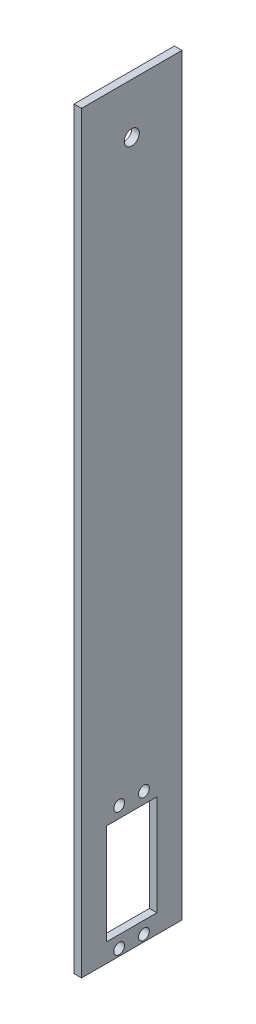
ISO-10303-21;
HEADER;
FILE_DESCRIPTION(('STEP AP214'),'2;1');
FILE_NAME('part.step','',(''),(''),'','','');
FILE_SCHEMA(('AUTOMOTIVE_DESIGN { 1 0 10303 214 1 1 1 1 }'));
ENDSEC;
DATA;
#1=APPLICATION_CONTEXT('core data for automotive mechanical design processes');
#2=APPLICATION_PROTOCOL_DEFINITION('international standard','automotive_design',2000,#1);
#3=PRODUCT_CONTEXT('',#1,'mechanical');
#4=PRODUCT('Part','Part','',(#3));
#5=PRODUCT_RELATED_PRODUCT_CATEGORY('part','',(#4));
#6=PRODUCT_DEFINITION_FORMATION('','',#4);
#7=PRODUCT_DEFINITION_CONTEXT('part definition',#1,'design');
#8=PRODUCT_DEFINITION('design','',#6,#7);
#9=PRODUCT_DEFINITION_SHAPE('','',#8);
#10=(LENGTH_UNIT() NAMED_UNIT(*) SI_UNIT(.MILLI.,.METRE.));
#11=(NAMED_UNIT(*) PLANE_ANGLE_UNIT() SI_UNIT($,.RADIAN.));
#12=(NAMED_UNIT(*) SI_UNIT($,.STERADIAN.) SOLID_ANGLE_UNIT());
#13=UNCERTAINTY_MEASURE_WITH_UNIT(LENGTH_MEASURE(1.E-05),#10,'distance_accuracy_value','');
#14=(GEOMETRIC_REPRESENTATION_CONTEXT(3) GLOBAL_UNCERTAINTY_ASSIGNED_CONTEXT((#13)) GLOBAL_UNIT_ASSIGNED_CONTEXT((#10,
#11,#12)) REPRESENTATION_CONTEXT('',''));
#15=CARTESIAN_POINT('',(0.,0.,0.));
#16=DIRECTION('',(0.,0.,1.));
#17=DIRECTION('',(1.,0.,0.));
#18=AXIS2_PLACEMENT_3D('',#15,#16,#17);
#19=CARTESIAN_POINT('',(3.,-150.,-20.));
#20=DIRECTION('',(0.,0.,1.));
#21=DIRECTION('',(1.,0.,0.));
#22=AXIS2_PLACEMENT_3D('',#19,#20,#21);
#23=PLANE('',#22);
#24=DIRECTION('',(0.,1.,0.));
#25=VECTOR('',#24,1.);
#26=CARTESIAN_POINT('',(0.,-150.,-20.));
#27=LINE('',#26,#25);
#28=CARTESIAN_POINT('',(0.,-150.,-20.));
#29=VERTEX_POINT('',#28);
#30=CARTESIAN_POINT('',(0.,150.,-20.));
#31=VERTEX_POINT('',#30);
#32=EDGE_CURVE('E141',#29,#31,#27,.T.);
#33=ORIENTED_EDGE('',*,*,#32,.T.);
#34=DIRECTION('',(-1.,0.,0.));
#35=VECTOR('',#34,1.);
#36=CARTESIAN_POINT('',(3.,150.,-20.));
#37=LINE('',#36,#35);
#38=CARTESIAN_POINT('',(3.,150.,-20.));
#39=VERTEX_POINT('',#38);
#40=EDGE_CURVE('E11',#39,#31,#37,.T.);
#41=ORIENTED_EDGE('',*,*,#40,.F.);
#42=DIRECTION('',(0.,1.,0.));
#43=VECTOR('',#42,1.);
#44=CARTESIAN_POINT('',(3.,-150.,-20.));
#45=LINE('',#44,#43);
#46=CARTESIAN_POINT('',(3.,-150.,-20.));
#47=VERTEX_POINT('',#46);
#48=EDGE_CURVE('E144',#47,#39,#45,.T.);
#49=ORIENTED_EDGE('',*,*,#48,.F.);
#50=DIRECTION('',(-1.,0.,0.));
#51=VECTOR('',#50,1.);
#52=CARTESIAN_POINT('',(3.,-150.,-20.));
#53=LINE('',#52,#51);
#54=EDGE_CURVE('E154',#47,#29,#53,.T.);
#55=ORIENTED_EDGE('',*,*,#54,.T.);
#56=EDGE_LOOP('',(#33,#41,#49,#55));
#57=FACE_BOUND('',#56,.T.);
#58=ADVANCED_FACE('F33',(#57),#23,.F.);
#59=CARTESIAN_POINT('',(3.,150.,20.));
#60=DIRECTION('',(0.,-1.,0.));
#61=DIRECTION('',(0.,0.,-1.));
#62=AXIS2_PLACEMENT_3D('',#59,#60,#61);
#63=PLANE('',#62);
#64=DIRECTION('',(0.,0.,1.));
#65=VECTOR('',#64,1.);
#66=CARTESIAN_POINT('',(0.,150.,20.));
#67=LINE('',#66,#65);
#68=CARTESIAN_POINT('',(0.,150.,20.));
#69=VERTEX_POINT('',#68);
#70=EDGE_CURVE('E157',#31,#69,#67,.T.);
#71=ORIENTED_EDGE('',*,*,#70,.T.);
#72=DIRECTION('',(-1.,0.,0.));
#73=VECTOR('',#72,1.);
#74=CARTESIAN_POINT('',(3.,150.,20.));
#75=LINE('',#74,#73);
#76=CARTESIAN_POINT('',(3.,150.,20.));
#77=VERTEX_POINT('',#76);
#78=EDGE_CURVE('E40',#77,#69,#75,.T.);
#79=ORIENTED_EDGE('',*,*,#78,.F.);
#80=DIRECTION('',(0.,0.,1.));
#81=VECTOR('',#80,1.);
#82=CARTESIAN_POINT('',(3.,150.,20.));
#83=LINE('',#82,#81);
#84=EDGE_CURVE('E147',#39,#77,#83,.T.);
#85=ORIENTED_EDGE('',*,*,#84,.F.);
#86=ORIENTED_EDGE('',*,*,#40,.T.);
#87=EDGE_LOOP('',(#71,#79,#85,#86));
#88=FACE_BOUND('',#87,.T.);
#89=ADVANCED_FACE('F186',(#88),#63,.F.);
#90=CARTESIAN_POINT('',(3.,-150.,20.));
#91=DIRECTION('',(0.,0.,-1.));
#92=DIRECTION('',(-1.,0.,0.));
#93=AXIS2_PLACEMENT_3D('',#90,#91,#92);
#94=PLANE('',#93);
#95=DIRECTION('',(0.,-1.,0.));
#96=VECTOR('',#95,1.);
#97=CARTESIAN_POINT('',(0.,-150.,20.));
#98=LINE('',#97,#96);
#99=CARTESIAN_POINT('',(0.,-150.,20.));
#100=VERTEX_POINT('',#99);
#101=EDGE_CURVE('E159',#69,#100,#98,.T.);
#102=ORIENTED_EDGE('',*,*,#101,.T.);
#103=DIRECTION('',(-1.,0.,0.));
#104=VECTOR('',#103,1.);
#105=CARTESIAN_POINT('',(3.,-150.,20.));
#106=LINE('',#105,#104);
#107=CARTESIAN_POINT('',(3.,-150.,20.));
#108=VERTEX_POINT('',#107);
#109=EDGE_CURVE('E164',#108,#100,#106,.T.);
#110=ORIENTED_EDGE('',*,*,#109,.F.);
#111=DIRECTION('',(0.,-1.,0.));
#112=VECTOR('',#111,1.);
#113=CARTESIAN_POINT('',(3.,-150.,20.));
#114=LINE('',#113,#112);
#115=EDGE_CURVE('E150',#77,#108,#114,.T.);
#116=ORIENTED_EDGE('',*,*,#115,.F.);
#117=ORIENTED_EDGE('',*,*,#78,.T.);
#118=EDGE_LOOP('',(#102,#110,#116,#117));
#119=FACE_BOUND('',#118,.T.);
#120=ADVANCED_FACE('F171',(#119),#94,.F.);
#121=CARTESIAN_POINT('',(3.,-150.,20.));
#122=DIRECTION('',(0.,1.,0.));
#123=DIRECTION('',(0.,0.,1.));
#124=AXIS2_PLACEMENT_3D('',#121,#122,#123);
#125=PLANE('',#124);
#126=DIRECTION('',(0.,0.,-1.));
#127=VECTOR('',#126,1.);
#128=CARTESIAN_POINT('',(0.,-150.,20.));
#129=LINE('',#128,#127);
#130=EDGE_CURVE('E148',#100,#29,#129,.T.);
#131=ORIENTED_EDGE('',*,*,#130,.T.);
#132=ORIENTED_EDGE('',*,*,#54,.F.);
#133=DIRECTION('',(0.,0.,-1.));
#134=VECTOR('',#133,1.);
#135=CARTESIAN_POINT('',(3.,-150.,20.));
#136=LINE('',#135,#134);
#137=EDGE_CURVE('E152',#108,#47,#136,.T.);
#138=ORIENTED_EDGE('',*,*,#137,.F.);
#139=ORIENTED_EDGE('',*,*,#109,.T.);
#140=EDGE_LOOP('',(#131,#132,#138,#139));
#141=FACE_BOUND('',#140,.T.);
#142=ADVANCED_FACE('F179',(#141),#125,.F.);
#143=CARTESIAN_POINT('',(3.,0.,0.));
#144=DIRECTION('',(-1.,0.,0.));
#145=DIRECTION('',(0.,0.,1.));
#146=AXIS2_PLACEMENT_3D('',#143,#144,#145);
#147=PLANE('',#146);
#148=CARTESIAN_POINT('',(3.,-98.01,-4.84499999999997));
#149=DIRECTION('',(1.,0.,0.));
#150=DIRECTION('',(0.,0.,-1.));
#151=AXIS2_PLACEMENT_3D('',#148,#149,#150);
#152=CIRCLE('',#151,2.15);
#153=CARTESIAN_POINT('',(3.,-98.01,-6.99499999999997));
#154=VERTEX_POINT('',#153);
#155=EDGE_CURVE('E121',#154,#154,#152,.T.);
#156=ORIENTED_EDGE('',*,*,#155,.F.);
#157=EDGE_LOOP('',(#156));
#158=FACE_BOUND('',#157,.T.);
#159=CARTESIAN_POINT('',(3.,-98.01,5.02499999999999));
#160=DIRECTION('',(1.,0.,0.));
#161=DIRECTION('',(0.,0.,-1.));
#162=AXIS2_PLACEMENT_3D('',#159,#160,#161);
#163=CIRCLE('',#162,2.14999999999999);
#164=CARTESIAN_POINT('',(3.,-98.01,2.875));
#165=VERTEX_POINT('',#164);
#166=EDGE_CURVE('E253',#165,#165,#163,.T.);
#167=ORIENTED_EDGE('',*,*,#166,.F.);
#168=EDGE_LOOP('',(#167));
#169=FACE_BOUND('',#168,.T.);
#170=CARTESIAN_POINT('',(3.,-147.31,-4.84499999999999));
#171=DIRECTION('',(1.,0.,0.));
#172=DIRECTION('',(0.,0.,-1.));
#173=AXIS2_PLACEMENT_3D('',#170,#171,#172);
#174=CIRCLE('',#173,2.15000000000001);
#175=CARTESIAN_POINT('',(3.,-147.31,-6.995));
#176=VERTEX_POINT('',#175);
#177=EDGE_CURVE('E245',#176,#176,#174,.T.);
#178=ORIENTED_EDGE('',*,*,#177,.F.);
#179=EDGE_LOOP('',(#178));
#180=FACE_BOUND('',#179,.T.);
#181=CARTESIAN_POINT('',(3.,-147.31,5.02500000000001));
#182=DIRECTION('',(1.,0.,0.));
#183=DIRECTION('',(0.,0.,-1.));
#184=AXIS2_PLACEMENT_3D('',#181,#182,#183);
#185=CIRCLE('',#184,2.15000000000001);
#186=CARTESIAN_POINT('',(3.,-147.31,2.875));
#187=VERTEX_POINT('',#186);
#188=EDGE_CURVE('E239',#187,#187,#185,.T.);
#189=ORIENTED_EDGE('',*,*,#188,.F.);
#190=EDGE_LOOP('',(#189));
#191=FACE_BOUND('',#190,.T.);
#192=DIRECTION('',(0.,0.,1.));
#193=VECTOR('',#192,1.);
#194=CARTESIAN_POINT('',(3.,-102.5,10.));
#195=LINE('',#194,#193);
#196=CARTESIAN_POINT('',(3.,-102.5,-10.));
#197=VERTEX_POINT('',#196);
#198=CARTESIAN_POINT('',(3.,-102.5,10.));
#199=VERTEX_POINT('',#198);
#200=EDGE_CURVE('E127',#197,#199,#195,.T.);
#201=ORIENTED_EDGE('',*,*,#200,.F.);
#202=DIRECTION('',(0.,1.,0.));
#203=VECTOR('',#202,1.);
#204=CARTESIAN_POINT('',(3.,-142.5,-10.));
#205=LINE('',#204,#203);
#206=CARTESIAN_POINT('',(3.,-142.5,-10.));
#207=VERTEX_POINT('',#206);
#208=EDGE_CURVE('E47',#207,#197,#205,.T.);
#209=ORIENTED_EDGE('',*,*,#208,.F.);
#210=DIRECTION('',(0.,0.,-1.));
#211=VECTOR('',#210,1.);
#212=CARTESIAN_POINT('',(3.,-142.5,10.));
#213=LINE('',#212,#211);
#214=CARTESIAN_POINT('',(3.,-142.5,10.));
#215=VERTEX_POINT('',#214);
#216=EDGE_CURVE('E115',#215,#207,#213,.T.);
#217=ORIENTED_EDGE('',*,*,#216,.F.);
#218=DIRECTION('',(0.,-1.,0.));
#219=VECTOR('',#218,1.);
#220=CARTESIAN_POINT('',(3.,-142.5,10.));
#221=LINE('',#220,#219);
#222=EDGE_CURVE('E118',#199,#215,#221,.T.);
#223=ORIENTED_EDGE('',*,*,#222,.F.);
#224=EDGE_LOOP('',(#201,#209,#217,#223));
#225=FACE_BOUND('',#224,.T.);
#226=CARTESIAN_POINT('',(3.,130.,0.));
#227=DIRECTION('',(1.,0.,0.));
#228=DIRECTION('',(0.,0.,-1.));
#229=AXIS2_PLACEMENT_3D('',#226,#227,#228);
#230=CIRCLE('',#229,3.);
#231=CARTESIAN_POINT('',(3.,130.,-3.));
#232=VERTEX_POINT('',#231);
#233=EDGE_CURVE('E134',#232,#232,#230,.T.);
#234=ORIENTED_EDGE('',*,*,#233,.F.);
#235=EDGE_LOOP('',(#234));
#236=FACE_BOUND('',#235,.T.);
#237=ORIENTED_EDGE('',*,*,#48,.T.);
#238=ORIENTED_EDGE('',*,*,#84,.T.);
#239=ORIENTED_EDGE('',*,*,#115,.T.);
#240=ORIENTED_EDGE('',*,*,#137,.T.);
#241=EDGE_LOOP('',(#237,#238,#239,#240));
#242=FACE_BOUND('',#241,.T.);
#243=ADVANCED_FACE('F185',(#158,#169,#180,#191,#225,#236,#242),#147,.F.);
#244=CARTESIAN_POINT('',(0.,0.,0.));
#245=DIRECTION('',(-1.,0.,0.));
#246=DIRECTION('',(0.,0.,1.));
#247=AXIS2_PLACEMENT_3D('',#244,#245,#246);
#248=PLANE('',#247);
#249=CARTESIAN_POINT('',(0.,-98.01,-4.84499999999997));
#250=DIRECTION('',(1.,0.,0.));
#251=DIRECTION('',(0.,0.,-1.));
#252=AXIS2_PLACEMENT_3D('',#249,#250,#251);
#253=CIRCLE('',#252,2.15);
#254=CARTESIAN_POINT('',(0.,-98.01,-6.99499999999997));
#255=VERTEX_POINT('',#254);
#256=EDGE_CURVE('E255',#255,#255,#253,.T.);
#257=ORIENTED_EDGE('',*,*,#256,.T.);
#258=EDGE_LOOP('',(#257));
#259=FACE_BOUND('',#258,.T.);
#260=CARTESIAN_POINT('',(0.,-98.01,5.02499999999999));
#261=DIRECTION('',(1.,0.,0.));
#262=DIRECTION('',(0.,0.,-1.));
#263=AXIS2_PLACEMENT_3D('',#260,#261,#262);
#264=CIRCLE('',#263,2.14999999999999);
#265=CARTESIAN_POINT('',(0.,-98.01,2.875));
#266=VERTEX_POINT('',#265);
#267=EDGE_CURVE('E250',#266,#266,#264,.T.);
#268=ORIENTED_EDGE('',*,*,#267,.T.);
#269=EDGE_LOOP('',(#268));
#270=FACE_BOUND('',#269,.T.);
#271=CARTESIAN_POINT('',(0.,-147.31,-4.84499999999999));
#272=DIRECTION('',(1.,0.,0.));
#273=DIRECTION('',(0.,0.,-1.));
#274=AXIS2_PLACEMENT_3D('',#271,#272,#273);
#275=CIRCLE('',#274,2.15000000000001);
#276=CARTESIAN_POINT('',(0.,-147.31,-6.995));
#277=VERTEX_POINT('',#276);
#278=EDGE_CURVE('E241',#277,#277,#275,.T.);
#279=ORIENTED_EDGE('',*,*,#278,.T.);
#280=EDGE_LOOP('',(#279));
#281=FACE_BOUND('',#280,.T.);
#282=CARTESIAN_POINT('',(0.,-147.31,5.02500000000001));
#283=DIRECTION('',(1.,0.,0.));
#284=DIRECTION('',(0.,0.,-1.));
#285=AXIS2_PLACEMENT_3D('',#282,#283,#284);
#286=CIRCLE('',#285,2.15000000000001);
#287=CARTESIAN_POINT('',(0.,-147.31,2.875));
#288=VERTEX_POINT('',#287);
#289=EDGE_CURVE('E128',#288,#288,#286,.T.);
#290=ORIENTED_EDGE('',*,*,#289,.T.);
#291=EDGE_LOOP('',(#290));
#292=FACE_BOUND('',#291,.T.);
#293=DIRECTION('',(0.,1.,0.));
#294=VECTOR('',#293,1.);
#295=CARTESIAN_POINT('',(0.,-142.5,-10.));
#296=LINE('',#295,#294);
#297=CARTESIAN_POINT('',(0.,-142.5,-10.));
#298=VERTEX_POINT('',#297);
#299=CARTESIAN_POINT('',(0.,-102.5,-10.));
#300=VERTEX_POINT('',#299);
#301=EDGE_CURVE('E99',#298,#300,#296,.T.);
#302=ORIENTED_EDGE('',*,*,#301,.T.);
#303=DIRECTION('',(0.,0.,1.));
#304=VECTOR('',#303,1.);
#305=CARTESIAN_POINT('',(0.,-102.5,10.));
#306=LINE('',#305,#304);
#307=CARTESIAN_POINT('',(0.,-102.5,10.));
#308=VERTEX_POINT('',#307);
#309=EDGE_CURVE('E108',#300,#308,#306,.T.);
#310=ORIENTED_EDGE('',*,*,#309,.T.);
#311=DIRECTION('',(0.,-1.,0.));
#312=VECTOR('',#311,1.);
#313=CARTESIAN_POINT('',(0.,-142.5,10.));
#314=LINE('',#313,#312);
#315=CARTESIAN_POINT('',(0.,-142.5,10.));
#316=VERTEX_POINT('',#315);
#317=EDGE_CURVE('E55',#308,#316,#314,.T.);
#318=ORIENTED_EDGE('',*,*,#317,.T.);
#319=DIRECTION('',(0.,0.,-1.));
#320=VECTOR('',#319,1.);
#321=CARTESIAN_POINT('',(0.,-142.5,10.));
#322=LINE('',#321,#320);
#323=EDGE_CURVE('E105',#316,#298,#322,.T.);
#324=ORIENTED_EDGE('',*,*,#323,.T.);
#325=EDGE_LOOP('',(#302,#310,#318,#324));
#326=FACE_BOUND('',#325,.T.);
#327=CARTESIAN_POINT('',(0.,130.,0.));
#328=DIRECTION('',(1.,0.,0.));
#329=DIRECTION('',(0.,0.,-1.));
#330=AXIS2_PLACEMENT_3D('',#327,#328,#329);
#331=CIRCLE('',#330,3.);
#332=CARTESIAN_POINT('',(0.,130.,-3.));
#333=VERTEX_POINT('',#332);
#334=EDGE_CURVE('E138',#333,#333,#331,.T.);
#335=ORIENTED_EDGE('',*,*,#334,.T.);
#336=EDGE_LOOP('',(#335));
#337=FACE_BOUND('',#336,.T.);
#338=ORIENTED_EDGE('',*,*,#32,.F.);
#339=ORIENTED_EDGE('',*,*,#130,.F.);
#340=ORIENTED_EDGE('',*,*,#101,.F.);
#341=ORIENTED_EDGE('',*,*,#70,.F.);
#342=EDGE_LOOP('',(#338,#339,#340,#341));
#343=FACE_BOUND('',#342,.T.);
#344=ADVANCED_FACE('F112',(#259,#270,#281,#292,#326,#337,#343),#248,.T.);
#345=CARTESIAN_POINT('',(0.,130.,0.));
#346=DIRECTION('',(1.,0.,0.));
#347=DIRECTION('',(0.,0.,-1.));
#348=AXIS2_PLACEMENT_3D('',#345,#346,#347);
#349=CYLINDRICAL_SURFACE('',#348,3.);
#350=ORIENTED_EDGE('',*,*,#334,.F.);
#351=EDGE_LOOP('',(#350));
#352=FACE_BOUND('',#351,.T.);
#353=ORIENTED_EDGE('',*,*,#233,.T.);
#354=EDGE_LOOP('',(#353));
#355=FACE_BOUND('',#354,.T.);
#356=ADVANCED_FACE('F198',(#352,#355),#349,.F.);
#357=CARTESIAN_POINT('',(0.,-142.5,-10.));
#358=DIRECTION('',(0.,0.,-1.));
#359=DIRECTION('',(-1.,0.,0.));
#360=AXIS2_PLACEMENT_3D('',#357,#358,#359);
#361=PLANE('',#360);
#362=ORIENTED_EDGE('',*,*,#208,.T.);
#363=DIRECTION('',(1.,0.,0.));
#364=VECTOR('',#363,1.);
#365=CARTESIAN_POINT('',(0.,-102.5,-10.));
#366=LINE('',#365,#364);
#367=EDGE_CURVE('E95',#300,#197,#366,.T.);
#368=ORIENTED_EDGE('',*,*,#367,.F.);
#369=ORIENTED_EDGE('',*,*,#301,.F.);
#370=DIRECTION('',(1.,0.,0.));
#371=VECTOR('',#370,1.);
#372=CARTESIAN_POINT('',(0.,-142.5,-10.));
#373=LINE('',#372,#371);
#374=EDGE_CURVE('E132',#298,#207,#373,.T.);
#375=ORIENTED_EDGE('',*,*,#374,.T.);
#376=EDGE_LOOP('',(#362,#368,#369,#375));
#377=FACE_BOUND('',#376,.T.);
#378=ADVANCED_FACE('F97',(#377),#361,.F.);
#379=CARTESIAN_POINT('',(0.,-142.5,10.));
#380=DIRECTION('',(0.,-1.,0.));
#381=DIRECTION('',(0.,0.,-1.));
#382=AXIS2_PLACEMENT_3D('',#379,#380,#381);
#383=PLANE('',#382);
#384=ORIENTED_EDGE('',*,*,#216,.T.);
#385=ORIENTED_EDGE('',*,*,#374,.F.);
#386=ORIENTED_EDGE('',*,*,#323,.F.);
#387=DIRECTION('',(1.,0.,0.));
#388=VECTOR('',#387,1.);
#389=CARTESIAN_POINT('',(0.,-142.5,10.));
#390=LINE('',#389,#388);
#391=EDGE_CURVE('E135',#316,#215,#390,.T.);
#392=ORIENTED_EDGE('',*,*,#391,.T.);
#393=EDGE_LOOP('',(#384,#385,#386,#392));
#394=FACE_BOUND('',#393,.T.);
#395=ADVANCED_FACE('F208',(#394),#383,.F.);
#396=CARTESIAN_POINT('',(0.,-142.5,10.));
#397=DIRECTION('',(0.,0.,1.));
#398=DIRECTION('',(1.,0.,0.));
#399=AXIS2_PLACEMENT_3D('',#396,#397,#398);
#400=PLANE('',#399);
#401=ORIENTED_EDGE('',*,*,#222,.T.);
#402=ORIENTED_EDGE('',*,*,#391,.F.);
#403=ORIENTED_EDGE('',*,*,#317,.F.);
#404=DIRECTION('',(1.,0.,0.));
#405=VECTOR('',#404,1.);
#406=CARTESIAN_POINT('',(0.,-102.5,10.));
#407=LINE('',#406,#405);
#408=EDGE_CURVE('E104',#308,#199,#407,.T.);
#409=ORIENTED_EDGE('',*,*,#408,.T.);
#410=EDGE_LOOP('',(#401,#402,#403,#409));
#411=FACE_BOUND('',#410,.T.);
#412=ADVANCED_FACE('F212',(#411),#400,.F.);
#413=CARTESIAN_POINT('',(0.,-102.5,10.));
#414=DIRECTION('',(0.,1.,0.));
#415=DIRECTION('',(0.,0.,1.));
#416=AXIS2_PLACEMENT_3D('',#413,#414,#415);
#417=PLANE('',#416);
#418=ORIENTED_EDGE('',*,*,#200,.T.);
#419=ORIENTED_EDGE('',*,*,#408,.F.);
#420=ORIENTED_EDGE('',*,*,#309,.F.);
#421=ORIENTED_EDGE('',*,*,#367,.T.);
#422=EDGE_LOOP('',(#418,#419,#420,#421));
#423=FACE_BOUND('',#422,.T.);
#424=ADVANCED_FACE('F109',(#423),#417,.F.);
#425=CARTESIAN_POINT('',(0.,-147.31,5.02500000000001));
#426=DIRECTION('',(1.,0.,0.));
#427=DIRECTION('',(0.,0.,-1.));
#428=AXIS2_PLACEMENT_3D('',#425,#426,#427);
#429=CYLINDRICAL_SURFACE('',#428,2.15000000000001);
#430=ORIENTED_EDGE('',*,*,#289,.F.);
#431=EDGE_LOOP('',(#430));
#432=FACE_BOUND('',#431,.T.);
#433=ORIENTED_EDGE('',*,*,#188,.T.);
#434=EDGE_LOOP('',(#433));
#435=FACE_BOUND('',#434,.T.);
#436=ADVANCED_FACE('F211',(#432,#435),#429,.F.);
#437=CARTESIAN_POINT('',(0.,-147.31,-4.84499999999999));
#438=DIRECTION('',(1.,0.,0.));
#439=DIRECTION('',(0.,0.,-1.));
#440=AXIS2_PLACEMENT_3D('',#437,#438,#439);
#441=CYLINDRICAL_SURFACE('',#440,2.15000000000001);
#442=ORIENTED_EDGE('',*,*,#278,.F.);
#443=EDGE_LOOP('',(#442));
#444=FACE_BOUND('',#443,.T.);
#445=ORIENTED_EDGE('',*,*,#177,.T.);
#446=EDGE_LOOP('',(#445));
#447=FACE_BOUND('',#446,.T.);
#448=ADVANCED_FACE('F225',(#444,#447),#441,.F.);
#449=CARTESIAN_POINT('',(0.,-98.01,5.02499999999999));
#450=DIRECTION('',(1.,0.,0.));
#451=DIRECTION('',(0.,0.,-1.));
#452=AXIS2_PLACEMENT_3D('',#449,#450,#451);
#453=CYLINDRICAL_SURFACE('',#452,2.14999999999999);
#454=ORIENTED_EDGE('',*,*,#267,.F.);
#455=EDGE_LOOP('',(#454));
#456=FACE_BOUND('',#455,.T.);
#457=ORIENTED_EDGE('',*,*,#166,.T.);
#458=EDGE_LOOP('',(#457));
#459=FACE_BOUND('',#458,.T.);
#460=ADVANCED_FACE('F221',(#456,#459),#453,.F.);
#461=CARTESIAN_POINT('',(0.,-98.01,-4.84499999999997));
#462=DIRECTION('',(1.,0.,0.));
#463=DIRECTION('',(0.,0.,-1.));
#464=AXIS2_PLACEMENT_3D('',#461,#462,#463);
#465=CYLINDRICAL_SURFACE('',#464,2.15);
#466=ORIENTED_EDGE('',*,*,#256,.F.);
#467=EDGE_LOOP('',(#466));
#468=FACE_BOUND('',#467,.T.);
#469=ORIENTED_EDGE('',*,*,#155,.T.);
#470=EDGE_LOOP('',(#469));
#471=FACE_BOUND('',#470,.T.);
#472=ADVANCED_FACE('F218',(#468,#471),#465,.F.);
#473=CLOSED_SHELL('',(#58,#89,#120,#142,#243,#344,#356,#378,#395,#412,#424,#436,#448,#460,#472));
#474=MANIFOLD_SOLID_BREP('B2',#473);
#475=ADVANCED_BREP_SHAPE_REPRESENTATION('',(#18,#474),#14);
#476=SHAPE_DEFINITION_REPRESENTATION(#9,#475);
ENDSEC;
END-ISO-10303-21;
